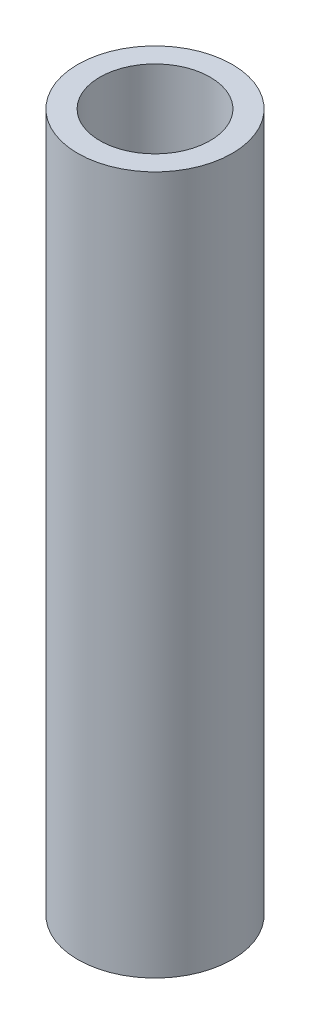
ISO-10303-21;
HEADER;
FILE_DESCRIPTION(('STEP AP214'),'2;1');
FILE_NAME('part.step','',(''),(''),'','','');
FILE_SCHEMA(('AUTOMOTIVE_DESIGN { 1 0 10303 214 1 1 1 1 }'));
ENDSEC;
DATA;
#1=APPLICATION_CONTEXT('core data for automotive mechanical design processes');
#2=APPLICATION_PROTOCOL_DEFINITION('international standard','automotive_design',2000,#1);
#3=PRODUCT_CONTEXT('',#1,'mechanical');
#4=PRODUCT('Part','Part','',(#3));
#5=PRODUCT_RELATED_PRODUCT_CATEGORY('part','',(#4));
#6=PRODUCT_DEFINITION_FORMATION('','',#4);
#7=PRODUCT_DEFINITION_CONTEXT('part definition',#1,'design');
#8=PRODUCT_DEFINITION('design','',#6,#7);
#9=PRODUCT_DEFINITION_SHAPE('','',#8);
#10=(LENGTH_UNIT() NAMED_UNIT(*) SI_UNIT(.MILLI.,.METRE.));
#11=(NAMED_UNIT(*) PLANE_ANGLE_UNIT() SI_UNIT($,.RADIAN.));
#12=(NAMED_UNIT(*) SI_UNIT($,.STERADIAN.) SOLID_ANGLE_UNIT());
#13=UNCERTAINTY_MEASURE_WITH_UNIT(LENGTH_MEASURE(1.E-05),#10,'distance_accuracy_value','');
#14=(GEOMETRIC_REPRESENTATION_CONTEXT(3) GLOBAL_UNCERTAINTY_ASSIGNED_CONTEXT((#13)) GLOBAL_UNIT_ASSIGNED_CONTEXT((#10,
#11,#12)) REPRESENTATION_CONTEXT('',''));
#15=CARTESIAN_POINT('',(0.,0.,0.));
#16=DIRECTION('',(0.,0.,1.));
#17=DIRECTION('',(1.,0.,0.));
#18=AXIS2_PLACEMENT_3D('',#15,#16,#17);
#19=CARTESIAN_POINT('',(0.,120.65,0.));
#20=DIRECTION('',(0.,1.,0.));
#21=DIRECTION('',(0.,0.,1.));
#22=AXIS2_PLACEMENT_3D('',#19,#20,#21);
#23=PLANE('',#22);
#24=CARTESIAN_POINT('',(0.,120.65,0.));
#25=DIRECTION('',(0.,1.,0.));
#26=DIRECTION('',(0.,0.,1.));
#27=AXIS2_PLACEMENT_3D('',#24,#25,#26);
#28=CIRCLE('',#27,13.335);
#29=CARTESIAN_POINT('',(0.,120.65,-13.335));
#30=VERTEX_POINT('',#29);
#31=EDGE_CURVE('E10',#30,#30,#28,.T.);
#32=ORIENTED_EDGE('',*,*,#31,.T.);
#33=EDGE_LOOP('',(#32));
#34=FACE_BOUND('',#33,.T.);
#35=CARTESIAN_POINT('',(0.,120.65,0.));
#36=DIRECTION('',(0.,1.,0.));
#37=DIRECTION('',(0.,0.,1.));
#38=AXIS2_PLACEMENT_3D('',#35,#36,#37);
#39=CIRCLE('',#38,9.525);
#40=CARTESIAN_POINT('',(0.,120.65,-9.525));
#41=VERTEX_POINT('',#40);
#42=EDGE_CURVE('E56',#41,#41,#39,.T.);
#43=ORIENTED_EDGE('',*,*,#42,.F.);
#44=EDGE_LOOP('',(#43));
#45=FACE_BOUND('',#44,.T.);
#46=ADVANCED_FACE('F43',(#34,#45),#23,.T.);
#47=CARTESIAN_POINT('',(0.,0.,0.));
#48=DIRECTION('',(0.,1.,0.));
#49=DIRECTION('',(0.,0.,1.));
#50=AXIS2_PLACEMENT_3D('',#47,#48,#49);
#51=PLANE('',#50);
#52=CARTESIAN_POINT('',(0.,0.,0.));
#53=DIRECTION('',(0.,1.,0.));
#54=DIRECTION('',(0.,0.,1.));
#55=AXIS2_PLACEMENT_3D('',#52,#53,#54);
#56=CIRCLE('',#55,13.335);
#57=CARTESIAN_POINT('',(0.,0.,-13.335));
#58=VERTEX_POINT('',#57);
#59=EDGE_CURVE('E47',#58,#58,#56,.T.);
#60=ORIENTED_EDGE('',*,*,#59,.F.);
#61=EDGE_LOOP('',(#60));
#62=FACE_BOUND('',#61,.T.);
#63=CARTESIAN_POINT('',(0.,0.,0.));
#64=DIRECTION('',(0.,1.,0.));
#65=DIRECTION('',(0.,0.,1.));
#66=AXIS2_PLACEMENT_3D('',#63,#64,#65);
#67=CIRCLE('',#66,9.525);
#68=CARTESIAN_POINT('',(0.,0.,-9.525));
#69=VERTEX_POINT('',#68);
#70=EDGE_CURVE('E58',#69,#69,#67,.T.);
#71=ORIENTED_EDGE('',*,*,#70,.T.);
#72=EDGE_LOOP('',(#71));
#73=FACE_BOUND('',#72,.T.);
#74=ADVANCED_FACE('F70',(#62,#73),#51,.F.);
#75=CARTESIAN_POINT('',(0.,120.65,0.));
#76=DIRECTION('',(0.,-1.,0.));
#77=DIRECTION('',(0.,0.,-1.));
#78=AXIS2_PLACEMENT_3D('',#75,#76,#77);
#79=CYLINDRICAL_SURFACE('',#78,13.335);
#80=CARTESIAN_POINT('',(0.,120.65,-13.335));
#81=CARTESIAN_POINT('',(0.,119.393229166667,-13.335));
#82=CARTESIAN_POINT('',(0.,118.136458333333,-13.335));
#83=CARTESIAN_POINT('',(0.,115.622916666667,-13.335));
#84=CARTESIAN_POINT('',(0.,114.366145833333,-13.335));
#85=CARTESIAN_POINT('',(0.,111.852604166667,-13.335));
#86=CARTESIAN_POINT('',(0.,110.595833333333,-13.335));
#87=CARTESIAN_POINT('',(0.,108.082291666667,-13.335));
#88=CARTESIAN_POINT('',(0.,106.825520833333,-13.335));
#89=CARTESIAN_POINT('',(0.,104.311979166667,-13.335));
#90=CARTESIAN_POINT('',(0.,103.055208333333,-13.335));
#91=CARTESIAN_POINT('',(0.,100.541666666667,-13.335));
#92=CARTESIAN_POINT('',(0.,99.2848958333333,-13.335));
#93=CARTESIAN_POINT('',(0.,96.7713541666667,-13.335));
#94=CARTESIAN_POINT('',(0.,95.5145833333333,-13.335));
#95=CARTESIAN_POINT('',(0.,93.0010416666667,-13.335));
#96=CARTESIAN_POINT('',(0.,91.7442708333333,-13.335));
#97=CARTESIAN_POINT('',(0.,89.2307291666667,-13.335));
#98=CARTESIAN_POINT('',(0.,87.9739583333333,-13.335));
#99=CARTESIAN_POINT('',(0.,85.4604166666667,-13.335));
#100=CARTESIAN_POINT('',(0.,84.2036458333333,-13.335));
#101=CARTESIAN_POINT('',(0.,81.6901041666667,-13.335));
#102=CARTESIAN_POINT('',(0.,80.4333333333333,-13.335));
#103=CARTESIAN_POINT('',(0.,77.9197916666667,-13.335));
#104=CARTESIAN_POINT('',(0.,76.6630208333333,-13.335));
#105=CARTESIAN_POINT('',(0.,74.1494791666667,-13.335));
#106=CARTESIAN_POINT('',(0.,72.8927083333333,-13.335));
#107=CARTESIAN_POINT('',(0.,70.3791666666667,-13.335));
#108=CARTESIAN_POINT('',(0.,69.1223958333333,-13.335));
#109=CARTESIAN_POINT('',(0.,66.6088541666667,-13.335));
#110=CARTESIAN_POINT('',(0.,65.3520833333333,-13.335));
#111=CARTESIAN_POINT('',(0.,62.8385416666667,-13.335));
#112=CARTESIAN_POINT('',(0.,61.5817708333333,-13.335));
#113=CARTESIAN_POINT('',(0.,59.0682291666667,-13.335));
#114=CARTESIAN_POINT('',(0.,57.8114583333333,-13.335));
#115=CARTESIAN_POINT('',(0.,55.2979166666667,-13.335));
#116=CARTESIAN_POINT('',(0.,54.0411458333333,-13.335));
#117=CARTESIAN_POINT('',(0.,51.5276041666667,-13.335));
#118=CARTESIAN_POINT('',(0.,50.2708333333333,-13.335));
#119=CARTESIAN_POINT('',(0.,47.7572916666667,-13.335));
#120=CARTESIAN_POINT('',(0.,46.5005208333333,-13.335));
#121=CARTESIAN_POINT('',(0.,43.9869791666667,-13.335));
#122=CARTESIAN_POINT('',(0.,42.7302083333333,-13.335));
#123=CARTESIAN_POINT('',(0.,40.2166666666667,-13.335));
#124=CARTESIAN_POINT('',(0.,38.9598958333333,-13.335));
#125=CARTESIAN_POINT('',(0.,36.4463541666667,-13.335));
#126=CARTESIAN_POINT('',(0.,35.1895833333333,-13.335));
#127=CARTESIAN_POINT('',(0.,32.6760416666667,-13.335));
#128=CARTESIAN_POINT('',(0.,31.4192708333333,-13.335));
#129=CARTESIAN_POINT('',(0.,28.9057291666667,-13.335));
#130=CARTESIAN_POINT('',(0.,27.6489583333333,-13.335));
#131=CARTESIAN_POINT('',(0.,25.1354166666667,-13.335));
#132=CARTESIAN_POINT('',(0.,23.8786458333333,-13.335));
#133=CARTESIAN_POINT('',(0.,21.3651041666667,-13.335));
#134=CARTESIAN_POINT('',(0.,20.1083333333333,-13.335));
#135=CARTESIAN_POINT('',(0.,17.5947916666667,-13.335));
#136=CARTESIAN_POINT('',(0.,16.3380208333333,-13.335));
#137=CARTESIAN_POINT('',(0.,13.8244791666667,-13.335));
#138=CARTESIAN_POINT('',(0.,12.5677083333333,-13.335));
#139=CARTESIAN_POINT('',(0.,10.0541666666667,-13.335));
#140=CARTESIAN_POINT('',(0.,8.79739583333333,-13.335));
#141=CARTESIAN_POINT('',(0.,6.28385416666666,-13.335));
#142=CARTESIAN_POINT('',(0.,5.02708333333333,-13.335));
#143=CARTESIAN_POINT('',(0.,2.51354166666667,-13.335));
#144=CARTESIAN_POINT('',(0.,1.25677083333333,-13.335));
#145=CARTESIAN_POINT('',(0.,0.,-13.335));
#146=B_SPLINE_CURVE_WITH_KNOTS('',3,(#80,#81,#82,#83,#84,#85,#86,#87,#88,#89,#90,#91,#92,#93,
#94,#95,#96,#97,#98,#99,#100,#101,#102,#103,#104,#105,#106,#107,#108,#109,#110,#111,#112,#113,
#114,#115,#116,#117,#118,#119,#120,#121,#122,#123,#124,#125,#126,#127,#128,#129,#130,#131,#132,
#133,#134,#135,#136,#137,#138,#139,#140,#141,#142,#143,#144,#145),.UNSPECIFIED.,.F.,.F.,(4,2,2,
2,2,2,2,2,2,2,2,2,2,2,2,2,2,2,2,2,2,2,2,2,2,2,2,2,2,2,2,2,4),(0.,3.7703125,7.540625,11.3109375,
15.08125,18.8515625,22.621875,26.3921875,30.1625,33.9328125,37.703125,41.4734375,45.24375,
49.0140625,52.784375,56.5546875,60.325,64.0953125,67.865625,71.6359375,75.40625,79.1765625,
82.946875,86.7171875,90.4875,94.2578125,98.028125,101.7984375,105.56875,109.3390625,113.109375,
116.8796875,120.65),.UNSPECIFIED.);
#147=EDGE_CURVE('BSEAM45',#30,#58,#146,.T.);
#148=ORIENTED_EDGE('',*,*,#31,.F.);
#149=ORIENTED_EDGE('',*,*,#59,.T.);
#150=ORIENTED_EDGE('',*,*,#147,.T.);
#151=ORIENTED_EDGE('',*,*,#147,.F.);
#152=EDGE_LOOP('',(#148,#150,#149,#151));
#153=FACE_BOUND('',#152,.T.);
#154=ADVANCED_FACE('F45',(#153),#79,.T.);
#155=CARTESIAN_POINT('',(0.,120.65,0.));
#156=DIRECTION('',(0.,-1.,0.));
#157=DIRECTION('',(0.,0.,-1.));
#158=AXIS2_PLACEMENT_3D('',#155,#156,#157);
#159=CYLINDRICAL_SURFACE('',#158,9.525);
#160=CARTESIAN_POINT('',(0.,120.65,-9.525));
#161=CARTESIAN_POINT('',(0.,119.393229166667,-9.525));
#162=CARTESIAN_POINT('',(0.,118.136458333333,-9.525));
#163=CARTESIAN_POINT('',(0.,115.622916666667,-9.525));
#164=CARTESIAN_POINT('',(0.,114.366145833333,-9.525));
#165=CARTESIAN_POINT('',(0.,111.852604166667,-9.525));
#166=CARTESIAN_POINT('',(0.,110.595833333333,-9.525));
#167=CARTESIAN_POINT('',(0.,108.082291666667,-9.525));
#168=CARTESIAN_POINT('',(0.,106.825520833333,-9.525));
#169=CARTESIAN_POINT('',(0.,104.311979166667,-9.525));
#170=CARTESIAN_POINT('',(0.,103.055208333333,-9.525));
#171=CARTESIAN_POINT('',(0.,100.541666666667,-9.525));
#172=CARTESIAN_POINT('',(0.,99.2848958333333,-9.525));
#173=CARTESIAN_POINT('',(0.,96.7713541666667,-9.525));
#174=CARTESIAN_POINT('',(0.,95.5145833333333,-9.525));
#175=CARTESIAN_POINT('',(0.,93.0010416666667,-9.525));
#176=CARTESIAN_POINT('',(0.,91.7442708333333,-9.525));
#177=CARTESIAN_POINT('',(0.,89.2307291666666,-9.525));
#178=CARTESIAN_POINT('',(0.,87.9739583333333,-9.525));
#179=CARTESIAN_POINT('',(0.,85.4604166666666,-9.525));
#180=CARTESIAN_POINT('',(0.,84.2036458333333,-9.525));
#181=CARTESIAN_POINT('',(0.,81.6901041666667,-9.525));
#182=CARTESIAN_POINT('',(0.,80.4333333333333,-9.525));
#183=CARTESIAN_POINT('',(0.,77.9197916666667,-9.525));
#184=CARTESIAN_POINT('',(0.,76.6630208333333,-9.525));
#185=CARTESIAN_POINT('',(0.,74.1494791666667,-9.525));
#186=CARTESIAN_POINT('',(0.,72.8927083333333,-9.525));
#187=CARTESIAN_POINT('',(0.,70.3791666666667,-9.525));
#188=CARTESIAN_POINT('',(0.,69.1223958333333,-9.525));
#189=CARTESIAN_POINT('',(0.,66.6088541666666,-9.525));
#190=CARTESIAN_POINT('',(0.,65.3520833333333,-9.525));
#191=CARTESIAN_POINT('',(0.,62.8385416666667,-9.525));
#192=CARTESIAN_POINT('',(0.,61.5817708333333,-9.525));
#193=CARTESIAN_POINT('',(0.,59.0682291666667,-9.525));
#194=CARTESIAN_POINT('',(0.,57.8114583333333,-9.525));
#195=CARTESIAN_POINT('',(0.,55.2979166666667,-9.525));
#196=CARTESIAN_POINT('',(0.,54.0411458333333,-9.525));
#197=CARTESIAN_POINT('',(0.,51.5276041666667,-9.525));
#198=CARTESIAN_POINT('',(0.,50.2708333333333,-9.525));
#199=CARTESIAN_POINT('',(0.,47.7572916666667,-9.525));
#200=CARTESIAN_POINT('',(0.,46.5005208333333,-9.525));
#201=CARTESIAN_POINT('',(0.,43.9869791666667,-9.525));
#202=CARTESIAN_POINT('',(0.,42.7302083333333,-9.525));
#203=CARTESIAN_POINT('',(0.,40.2166666666667,-9.525));
#204=CARTESIAN_POINT('',(0.,38.9598958333333,-9.525));
#205=CARTESIAN_POINT('',(0.,36.4463541666667,-9.525));
#206=CARTESIAN_POINT('',(0.,35.1895833333333,-9.525));
#207=CARTESIAN_POINT('',(0.,32.6760416666667,-9.525));
#208=CARTESIAN_POINT('',(0.,31.4192708333333,-9.525));
#209=CARTESIAN_POINT('',(0.,28.9057291666667,-9.525));
#210=CARTESIAN_POINT('',(0.,27.6489583333333,-9.525));
#211=CARTESIAN_POINT('',(0.,25.1354166666667,-9.525));
#212=CARTESIAN_POINT('',(0.,23.8786458333333,-9.525));
#213=CARTESIAN_POINT('',(0.,21.3651041666667,-9.525));
#214=CARTESIAN_POINT('',(0.,20.1083333333333,-9.525));
#215=CARTESIAN_POINT('',(0.,17.5947916666667,-9.525));
#216=CARTESIAN_POINT('',(0.,16.3380208333333,-9.525));
#217=CARTESIAN_POINT('',(0.,13.8244791666667,-9.525));
#218=CARTESIAN_POINT('',(0.,12.5677083333333,-9.525));
#219=CARTESIAN_POINT('',(0.,10.0541666666667,-9.525));
#220=CARTESIAN_POINT('',(0.,8.79739583333333,-9.525));
#221=CARTESIAN_POINT('',(0.,6.28385416666666,-9.525));
#222=CARTESIAN_POINT('',(0.,5.02708333333333,-9.525));
#223=CARTESIAN_POINT('',(0.,2.51354166666666,-9.525));
#224=CARTESIAN_POINT('',(0.,1.25677083333333,-9.525));
#225=CARTESIAN_POINT('',(0.,0.,-9.525));
#226=B_SPLINE_CURVE_WITH_KNOTS('',3,(#160,#161,#162,#163,#164,#165,#166,#167,#168,#169,#170,
#171,#172,#173,#174,#175,#176,#177,#178,#179,#180,#181,#182,#183,#184,#185,#186,#187,#188,#189,
#190,#191,#192,#193,#194,#195,#196,#197,#198,#199,#200,#201,#202,#203,#204,#205,#206,#207,#208,
#209,#210,#211,#212,#213,#214,#215,#216,#217,#218,#219,#220,#221,#222,#223,#224,#225),
.UNSPECIFIED.,.F.,.F.,(4,2,2,2,2,2,2,2,2,2,2,2,2,2,2,2,2,2,2,2,2,2,2,2,2,2,2,2,2,2,2,2,4),(0.,
3.77031250000001,7.54062500000001,11.3109375,15.08125,18.8515625,22.621875,26.3921875,30.1625,
33.9328125,37.703125,41.4734375,45.24375,49.0140625,52.784375,56.5546875,60.325,64.0953125,
67.865625,71.6359375,75.40625,79.1765625,82.946875,86.7171875,90.4875,94.2578125,98.028125,
101.7984375,105.56875,109.3390625,113.109375,116.8796875,120.65),.UNSPECIFIED.);
#227=EDGE_CURVE('BSEAM66',#41,#69,#226,.T.);
#228=ORIENTED_EDGE('',*,*,#42,.T.);
#229=ORIENTED_EDGE('',*,*,#70,.F.);
#230=ORIENTED_EDGE('',*,*,#227,.T.);
#231=ORIENTED_EDGE('',*,*,#227,.F.);
#232=EDGE_LOOP('',(#228,#230,#229,#231));
#233=FACE_BOUND('',#232,.T.);
#234=ADVANCED_FACE('F66',(#233),#159,.F.);
#235=CLOSED_SHELL('',(#46,#74,#154,#234));
#236=MANIFOLD_SOLID_BREP('B2',#235);
#237=ADVANCED_BREP_SHAPE_REPRESENTATION('',(#18,#236),#14);
#238=SHAPE_DEFINITION_REPRESENTATION(#9,#237);
ENDSEC;
END-ISO-10303-21;
